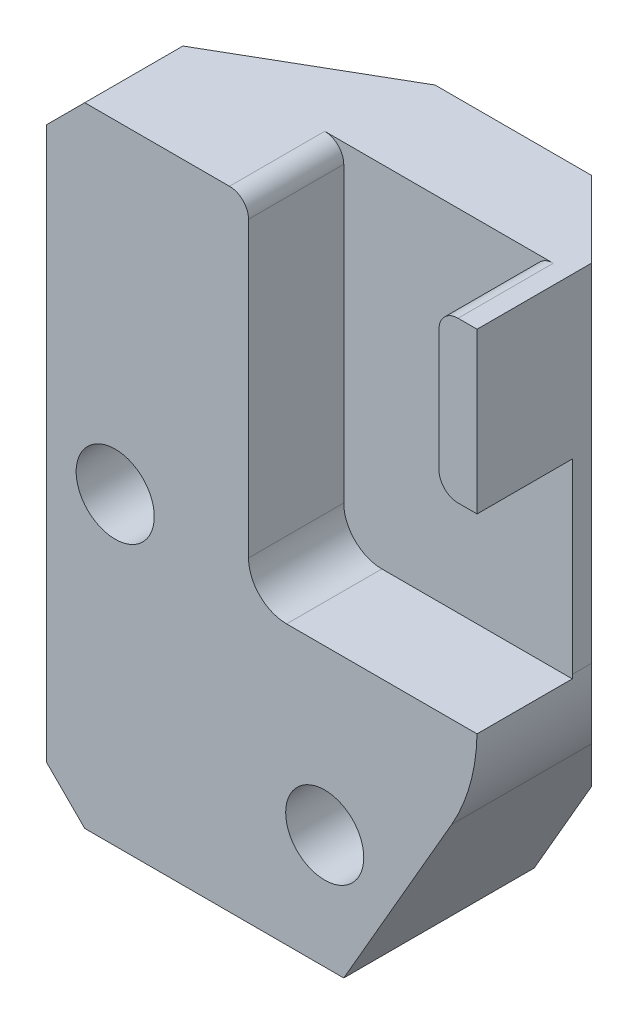
ISO-10303-21;
HEADER;
FILE_DESCRIPTION(('STEP AP214'),'2;1');
FILE_NAME('part.step','',(''),(''),'','','');
FILE_SCHEMA(('AUTOMOTIVE_DESIGN { 1 0 10303 214 1 1 1 1 }'));
ENDSEC;
DATA;
#1=APPLICATION_CONTEXT('core data for automotive mechanical design processes');
#2=APPLICATION_PROTOCOL_DEFINITION('international standard','automotive_design',2000,#1);
#3=PRODUCT_CONTEXT('',#1,'mechanical');
#4=PRODUCT('Part','Part','',(#3));
#5=PRODUCT_RELATED_PRODUCT_CATEGORY('part','',(#4));
#6=PRODUCT_DEFINITION_FORMATION('','',#4);
#7=PRODUCT_DEFINITION_CONTEXT('part definition',#1,'design');
#8=PRODUCT_DEFINITION('design','',#6,#7);
#9=PRODUCT_DEFINITION_SHAPE('','',#8);
#10=(LENGTH_UNIT() NAMED_UNIT(*) SI_UNIT(.MILLI.,.METRE.));
#11=(NAMED_UNIT(*) PLANE_ANGLE_UNIT() SI_UNIT($,.RADIAN.));
#12=(NAMED_UNIT(*) SI_UNIT($,.STERADIAN.) SOLID_ANGLE_UNIT());
#13=UNCERTAINTY_MEASURE_WITH_UNIT(LENGTH_MEASURE(1.E-05),#10,'distance_accuracy_value','');
#14=(GEOMETRIC_REPRESENTATION_CONTEXT(3) GLOBAL_UNCERTAINTY_ASSIGNED_CONTEXT((#13)) GLOBAL_UNIT_ASSIGNED_CONTEXT((#10,
#11,#12)) REPRESENTATION_CONTEXT('',''));
#15=CARTESIAN_POINT('',(0.,0.,0.));
#16=DIRECTION('',(0.,0.,1.));
#17=DIRECTION('',(1.,0.,0.));
#18=AXIS2_PLACEMENT_3D('',#15,#16,#17);
#19=CARTESIAN_POINT('',(-2.49999999999985,-10.,5.));
#20=DIRECTION('',(0.,0.,1.));
#21=DIRECTION('',(1.,0.,0.));
#22=AXIS2_PLACEMENT_3D('',#19,#20,#21);
#23=PLANE('',#22);
#24=CARTESIAN_POINT('',(-1.49999999999985,-7.00000000000001,5.));
#25=DIRECTION('',(0.,0.,1.));
#26=DIRECTION('',(1.,0.,0.));
#27=AXIS2_PLACEMENT_3D('',#24,#25,#26);
#28=CIRCLE('',#27,1.02499999999999);
#29=CARTESIAN_POINT('',(-0.47499999999986,-7.00000000000001,5.));
#30=VERTEX_POINT('',#29);
#31=EDGE_CURVE('E237',#30,#30,#28,.T.);
#32=ORIENTED_EDGE('',*,*,#31,.F.);
#33=EDGE_LOOP('',(#32));
#34=FACE_BOUND('',#33,.T.);
#35=CARTESIAN_POINT('',(-6.99999999999994,-1.99999999999999,5.));
#36=DIRECTION('',(0.,0.,1.));
#37=DIRECTION('',(1.,0.,0.));
#38=AXIS2_PLACEMENT_3D('',#35,#36,#37);
#39=CIRCLE('',#38,1.02499999999999);
#40=CARTESIAN_POINT('',(-5.97499999999995,-1.99999999999999,5.));
#41=VERTEX_POINT('',#40);
#42=EDGE_CURVE('E240',#41,#41,#39,.T.);
#43=ORIENTED_EDGE('',*,*,#42,.F.);
#44=EDGE_LOOP('',(#43));
#45=FACE_BOUND('',#44,.T.);
#46=DIRECTION('',(-0.500000000000001,-0.866025403784437,0.));
#47=VECTOR('',#46,1.);
#48=CARTESIAN_POINT('',(-1.37499999999995,-10.6495190528383,5.));
#49=LINE('',#48,#47);
#50=CARTESIAN_POINT('',(-0.999999999999987,-10.,5.));
#51=VERTEX_POINT('',#50);
#52=CARTESIAN_POINT('',(1.83012701892218,-5.09807621135332,5.));
#53=VERTEX_POINT('',#52);
#54=EDGE_CURVE('E293',#51,#53,#49,.F.);
#55=ORIENTED_EDGE('',*,*,#54,.T.);
#56=CARTESIAN_POINT('',(-2.49999999999993,-2.59807621135331,5.));
#57=DIRECTION('',(0.,0.,1.));
#58=DIRECTION('',(1.,0.,0.));
#59=AXIS2_PLACEMENT_3D('',#56,#57,#58);
#60=CIRCLE('',#59,5.);
#61=CARTESIAN_POINT('',(2.49896104618835,-2.7,5.));
#62=VERTEX_POINT('',#61);
#63=EDGE_CURVE('E60',#53,#62,#60,.T.);
#64=ORIENTED_EDGE('',*,*,#63,.T.);
#65=DIRECTION('',(-1.,0.,0.));
#66=VECTOR('',#65,1.);
#67=CARTESIAN_POINT('',(-2.5,-2.7,5.));
#68=LINE('',#67,#66);
#69=CARTESIAN_POINT('',(-2.5,-2.7,5.));
#70=VERTEX_POINT('',#69);
#71=EDGE_CURVE('E201',#62,#70,#68,.T.);
#72=ORIENTED_EDGE('',*,*,#71,.T.);
#73=CARTESIAN_POINT('',(-2.49999999999993,-1.70000000000001,5.));
#74=DIRECTION('',(0.,0.,-1.));
#75=DIRECTION('',(1.,0.,0.));
#76=AXIS2_PLACEMENT_3D('',#73,#74,#75);
#77=CIRCLE('',#76,1.);
#78=CARTESIAN_POINT('',(-3.49999999999993,-1.7,5.));
#79=VERTEX_POINT('',#78);
#80=EDGE_CURVE('E204',#70,#79,#77,.T.);
#81=ORIENTED_EDGE('',*,*,#80,.T.);
#82=DIRECTION('',(0.,1.,0.));
#83=VECTOR('',#82,1.);
#84=CARTESIAN_POINT('',(-3.5,5.5,5.));
#85=LINE('',#84,#83);
#86=CARTESIAN_POINT('',(-3.49999999999993,5.99999999999999,5.));
#87=VERTEX_POINT('',#86);
#88=EDGE_CURVE('E226',#79,#87,#85,.T.);
#89=ORIENTED_EDGE('',*,*,#88,.T.);
#90=CARTESIAN_POINT('',(-3.99999999999985,6.,5.));
#91=DIRECTION('',(0.,0.,1.));
#92=DIRECTION('',(1.,0.,0.));
#93=AXIS2_PLACEMENT_3D('',#90,#91,#92);
#94=CIRCLE('',#93,0.5);
#95=CARTESIAN_POINT('',(-4.,6.5,5.));
#96=VERTEX_POINT('',#95);
#97=EDGE_CURVE('E278',#87,#96,#94,.T.);
#98=ORIENTED_EDGE('',*,*,#97,.T.);
#99=DIRECTION('',(1.,0.,0.));
#100=VECTOR('',#99,1.);
#101=CARTESIAN_POINT('',(-9.29999999999993,6.5,5.));
#102=LINE('',#101,#100);
#103=CARTESIAN_POINT('',(-7.79999999999993,6.5,5.));
#104=VERTEX_POINT('',#103);
#105=EDGE_CURVE('E207',#104,#96,#102,.T.);
#106=ORIENTED_EDGE('',*,*,#105,.F.);
#107=DIRECTION('',(-0.70710678118655,-0.707106781186546,0.));
#108=VECTOR('',#107,1.);
#109=CARTESIAN_POINT('',(-13.4,0.900000000000034,5.));
#110=LINE('',#109,#108);
#111=CARTESIAN_POINT('',(-8.79999999999985,5.49999999999999,5.));
#112=VERTEX_POINT('',#111);
#113=EDGE_CURVE('E301',#104,#112,#110,.T.);
#114=ORIENTED_EDGE('',*,*,#113,.T.);
#115=DIRECTION('',(0.,1.,0.));
#116=VECTOR('',#115,1.);
#117=CARTESIAN_POINT('',(-8.79999999999985,-10.,5.));
#118=LINE('',#117,#116);
#119=CARTESIAN_POINT('',(-8.79999999999992,-8.99999999999999,5.));
#120=VERTEX_POINT('',#119);
#121=EDGE_CURVE('E350',#120,#112,#118,.T.);
#122=ORIENTED_EDGE('',*,*,#121,.F.);
#123=DIRECTION('',(0.707106781186548,-0.707106781186547,0.));
#124=VECTOR('',#123,1.);
#125=CARTESIAN_POINT('',(-5.15,-12.65,5.));
#126=LINE('',#125,#124);
#127=CARTESIAN_POINT('',(-7.79999999999993,-10.,5.));
#128=VERTEX_POINT('',#127);
#129=EDGE_CURVE('E303',#120,#128,#126,.T.);
#130=ORIENTED_EDGE('',*,*,#129,.T.);
#131=DIRECTION('',(1.,0.,0.));
#132=VECTOR('',#131,1.);
#133=CARTESIAN_POINT('',(-2.49999999999985,-10.,5.));
#134=LINE('',#133,#132);
#135=EDGE_CURVE('E243',#128,#51,#134,.T.);
#136=ORIENTED_EDGE('',*,*,#135,.T.);
#137=EDGE_LOOP('',(#55,#64,#72,#81,#89,#98,#106,#114,#122,#130,#136));
#138=FACE_BOUND('',#137,.T.);
#139=ADVANCED_FACE('F38',(#34,#45,#138),#23,.T.);
#140=CARTESIAN_POINT('',(-9.29999999999992,6.5,-12.3081273961557));
#141=DIRECTION('',(0.,-1.,0.));
#142=DIRECTION('',(0.,0.,-1.));
#143=AXIS2_PLACEMENT_3D('',#140,#141,#142);
#144=PLANE('',#143);
#145=DIRECTION('',(0.866025403784436,0.,-0.500000000000004));
#146=VECTOR('',#145,1.);
#147=CARTESIAN_POINT('',(-3.60384757729336,6.5,0.));
#148=LINE('',#147,#146);
#149=CARTESIAN_POINT('',(-7.8,6.5,2.42264973081036));
#150=VERTEX_POINT('',#149);
#151=CARTESIAN_POINT('',(-3.60384757729336,6.5,0.));
#152=VERTEX_POINT('',#151);
#153=EDGE_CURVE('E173',#150,#152,#148,.T.);
#154=ORIENTED_EDGE('',*,*,#153,.F.);
#155=DIRECTION('',(0.,0.,1.));
#156=VECTOR('',#155,1.);
#157=CARTESIAN_POINT('',(-7.79999999999993,6.5,5.));
#158=LINE('',#157,#156);
#159=EDGE_CURVE('E310',#150,#104,#158,.T.);
#160=ORIENTED_EDGE('',*,*,#159,.T.);
#161=ORIENTED_EDGE('',*,*,#105,.T.);
#162=DIRECTION('',(0.,0.,1.));
#163=VECTOR('',#162,1.);
#164=CARTESIAN_POINT('',(-4.,6.5,2.5));
#165=LINE('',#164,#163);
#166=CARTESIAN_POINT('',(-4.,6.5,2.5));
#167=VERTEX_POINT('',#166);
#168=EDGE_CURVE('E268',#96,#167,#165,.F.);
#169=ORIENTED_EDGE('',*,*,#168,.T.);
#170=DIRECTION('',(1.,0.,0.));
#171=VECTOR('',#170,1.);
#172=CARTESIAN_POINT('',(0.50000000000007,6.49999999999999,2.5));
#173=LINE('',#172,#171);
#174=CARTESIAN_POINT('',(2.00000000000007,6.5,2.5));
#175=VERTEX_POINT('',#174);
#176=EDGE_CURVE('E219',#167,#175,#173,.T.);
#177=ORIENTED_EDGE('',*,*,#176,.T.);
#178=DIRECTION('',(0.,0.,-1.));
#179=VECTOR('',#178,1.);
#180=CARTESIAN_POINT('',(2.00000000000007,6.5,5.));
#181=LINE('',#180,#179);
#182=CARTESIAN_POINT('',(2.00000000000007,6.5,5.));
#183=VERTEX_POINT('',#182);
#184=EDGE_CURVE('E271',#175,#183,#181,.F.);
#185=ORIENTED_EDGE('',*,*,#184,.T.);
#186=CARTESIAN_POINT('',(2.50000000000007,6.5,5.));
#187=VERTEX_POINT('',#186);
#188=EDGE_CURVE('E345',#183,#187,#102,.T.);
#189=ORIENTED_EDGE('',*,*,#188,.T.);
#190=DIRECTION('',(0.,0.,1.));
#191=VECTOR('',#190,1.);
#192=CARTESIAN_POINT('',(2.50000000000007,6.5,-12.3081273961558));
#193=LINE('',#192,#191);
#194=CARTESIAN_POINT('',(2.50000000000007,6.5,1.99999999999999));
#195=VERTEX_POINT('',#194);
#196=EDGE_CURVE('E202',#195,#187,#193,.T.);
#197=ORIENTED_EDGE('',*,*,#196,.F.);
#198=DIRECTION('',(0.707106781186549,0.,0.707106781186546));
#199=VECTOR('',#198,1.);
#200=CARTESIAN_POINT('',(2.50000000000007,6.5,1.99999999999999));
#201=LINE('',#200,#199);
#202=CARTESIAN_POINT('',(0.499999999999987,6.5,0.));
#203=VERTEX_POINT('',#202);
#204=EDGE_CURVE('E200',#195,#203,#201,.F.);
#205=ORIENTED_EDGE('',*,*,#204,.T.);
#206=DIRECTION('',(-1.,0.,0.));
#207=VECTOR('',#206,1.);
#208=CARTESIAN_POINT('',(-9.29999999999993,6.5,0.));
#209=LINE('',#208,#207);
#210=EDGE_CURVE('E191',#203,#152,#209,.T.);
#211=ORIENTED_EDGE('',*,*,#210,.T.);
#212=EDGE_LOOP('',(#154,#160,#161,#169,#177,#185,#189,#197,#205,#211));
#213=FACE_BOUND('',#212,.T.);
#214=ADVANCED_FACE('F197',(#213),#144,.F.);
#215=CARTESIAN_POINT('',(-2.49999999999985,-10.,5.));
#216=DIRECTION('',(0.,1.,0.));
#217=DIRECTION('',(0.,0.,1.));
#218=AXIS2_PLACEMENT_3D('',#215,#216,#217);
#219=PLANE('',#218);
#220=ORIENTED_EDGE('',*,*,#135,.F.);
#221=DIRECTION('',(0.,0.,-1.));
#222=VECTOR('',#221,1.);
#223=CARTESIAN_POINT('',(-7.79999999999993,-10.,3.));
#224=LINE('',#223,#222);
#225=CARTESIAN_POINT('',(-7.79999999999993,-10.,2.42264973081036));
#226=VERTEX_POINT('',#225);
#227=EDGE_CURVE('E305',#128,#226,#224,.T.);
#228=ORIENTED_EDGE('',*,*,#227,.T.);
#229=DIRECTION('',(-0.866025403784436,0.,0.500000000000004));
#230=VECTOR('',#229,1.);
#231=CARTESIAN_POINT('',(-3.60384757729343,-10.,0.));
#232=LINE('',#231,#230);
#233=CARTESIAN_POINT('',(-3.60384757729343,-10.,0.));
#234=VERTEX_POINT('',#233);
#235=EDGE_CURVE('E366',#234,#226,#232,.T.);
#236=ORIENTED_EDGE('',*,*,#235,.F.);
#237=DIRECTION('',(1.,0.,0.));
#238=VECTOR('',#237,1.);
#239=CARTESIAN_POINT('',(-2.49999999999993,-10.,0.));
#240=LINE('',#239,#238);
#241=CARTESIAN_POINT('',(-0.999999999999987,-10.,0.));
#242=VERTEX_POINT('',#241);
#243=EDGE_CURVE('E194',#234,#242,#240,.T.);
#244=ORIENTED_EDGE('',*,*,#243,.T.);
#245=DIRECTION('',(0.,0.,1.));
#246=VECTOR('',#245,1.);
#247=CARTESIAN_POINT('',(-0.999999999999987,-10.,5.));
#248=LINE('',#247,#246);
#249=EDGE_CURVE('E290',#242,#51,#248,.T.);
#250=ORIENTED_EDGE('',*,*,#249,.T.);
#251=EDGE_LOOP('',(#220,#228,#236,#244,#250));
#252=FACE_BOUND('',#251,.T.);
#253=ADVANCED_FACE('F364',(#252),#219,.F.);
#254=CARTESIAN_POINT('',(-2.49999999999993,-10.,0.));
#255=DIRECTION('',(0.,0.,1.));
#256=DIRECTION('',(1.,0.,0.));
#257=AXIS2_PLACEMENT_3D('',#254,#255,#256);
#258=PLANE('',#257);
#259=CARTESIAN_POINT('',(-1.49999999999985,-7.,0.));
#260=DIRECTION('',(0.,0.,-1.));
#261=DIRECTION('',(-1.,0.,0.));
#262=AXIS2_PLACEMENT_3D('',#259,#260,#261);
#263=CIRCLE('',#262,1.02499999999999);
#264=CARTESIAN_POINT('',(-2.52499999999984,-7.,0.));
#265=VERTEX_POINT('',#264);
#266=EDGE_CURVE('E234',#265,#265,#263,.T.);
#267=ORIENTED_EDGE('',*,*,#266,.F.);
#268=EDGE_LOOP('',(#267));
#269=FACE_BOUND('',#268,.T.);
#270=ORIENTED_EDGE('',*,*,#243,.F.);
#271=DIRECTION('',(0.,1.,0.));
#272=VECTOR('',#271,1.);
#273=CARTESIAN_POINT('',(-3.60384757729343,-16.,0.));
#274=LINE('',#273,#272);
#275=EDGE_CURVE('E178',#234,#152,#274,.T.);
#276=ORIENTED_EDGE('',*,*,#275,.T.);
#277=ORIENTED_EDGE('',*,*,#210,.F.);
#278=DIRECTION('',(0.,-1.,0.));
#279=VECTOR('',#278,1.);
#280=CARTESIAN_POINT('',(0.500000000000056,-10.,0.));
#281=LINE('',#280,#279);
#282=CARTESIAN_POINT('',(0.50000000000007,-7.40192378864668,0.));
#283=VERTEX_POINT('',#282);
#284=EDGE_CURVE('E252',#203,#283,#281,.T.);
#285=ORIENTED_EDGE('',*,*,#284,.T.);
#286=DIRECTION('',(0.500000000000001,0.866025403784437,0.));
#287=VECTOR('',#286,1.);
#288=CARTESIAN_POINT('',(2.50000000000006,-3.93782217350893,0.));
#289=LINE('',#288,#287);
#290=EDGE_CURVE('E288',#283,#242,#289,.F.);
#291=ORIENTED_EDGE('',*,*,#290,.T.);
#292=EDGE_LOOP('',(#270,#276,#277,#285,#291));
#293=FACE_BOUND('',#292,.T.);
#294=ADVANCED_FACE('F189',(#269,#293),#258,.F.);
#295=ORIENTED_EDGE('',*,*,#188,.F.);
#296=CARTESIAN_POINT('',(2.0000000000001,6.00000000000001,5.));
#297=DIRECTION('',(0.,0.,1.));
#298=DIRECTION('',(1.,0.,0.));
#299=AXIS2_PLACEMENT_3D('',#296,#297,#298);
#300=CIRCLE('',#299,0.5);
#301=CARTESIAN_POINT('',(1.50000000000007,6.,5.));
#302=VERTEX_POINT('',#301);
#303=EDGE_CURVE('E273',#183,#302,#300,.T.);
#304=ORIENTED_EDGE('',*,*,#303,.T.);
#305=DIRECTION('',(0.,-1.,0.));
#306=VECTOR('',#305,1.);
#307=CARTESIAN_POINT('',(1.50000000000007,-1.7,5.));
#308=LINE('',#307,#306);
#309=CARTESIAN_POINT('',(1.50000000000007,2.80000000000001,5.));
#310=VERTEX_POINT('',#309);
#311=EDGE_CURVE('E214',#302,#310,#308,.T.);
#312=ORIENTED_EDGE('',*,*,#311,.T.);
#313=CARTESIAN_POINT('',(2.00000000000015,2.79999999999999,5.));
#314=DIRECTION('',(0.,0.,1.));
#315=DIRECTION('',(1.,0.,0.));
#316=AXIS2_PLACEMENT_3D('',#313,#314,#315);
#317=CIRCLE('',#316,0.5);
#318=CARTESIAN_POINT('',(2.00000000000007,2.3,5.));
#319=VERTEX_POINT('',#318);
#320=EDGE_CURVE('E260',#310,#319,#317,.T.);
#321=ORIENTED_EDGE('',*,*,#320,.T.);
#322=DIRECTION('',(-1.,0.,0.));
#323=VECTOR('',#322,1.);
#324=CARTESIAN_POINT('',(0.50000000000007,2.29999999999999,5.));
#325=LINE('',#324,#323);
#326=CARTESIAN_POINT('',(2.50000000000014,2.3,5.));
#327=VERTEX_POINT('',#326);
#328=EDGE_CURVE('E347',#327,#319,#325,.T.);
#329=ORIENTED_EDGE('',*,*,#328,.F.);
#330=DIRECTION('',(0.,1.,0.));
#331=VECTOR('',#330,1.);
#332=CARTESIAN_POINT('',(2.50000000000007,10.,5.));
#333=LINE('',#332,#331);
#334=EDGE_CURVE('E245',#327,#187,#333,.T.);
#335=ORIENTED_EDGE('',*,*,#334,.T.);
#336=EDGE_LOOP('',(#295,#304,#312,#321,#329,#335));
#337=FACE_BOUND('',#336,.T.);
#338=ADVANCED_FACE('F360',(#337),#23,.T.);
#339=CARTESIAN_POINT('',(2.50000000000007,10.,5.));
#340=DIRECTION('',(-1.,0.,0.));
#341=DIRECTION('',(0.,0.,1.));
#342=AXIS2_PLACEMENT_3D('',#339,#340,#341);
#343=PLANE('',#342);
#344=DIRECTION('',(0.,-1.,0.));
#345=VECTOR('',#344,1.);
#346=CARTESIAN_POINT('',(2.50000000000007,-2.7,2.5));
#347=LINE('',#346,#345);
#348=CARTESIAN_POINT('',(2.50000000000007,2.3,2.5));
#349=VERTEX_POINT('',#348);
#350=CARTESIAN_POINT('',(2.50000000000007,-2.59807621135332,2.5));
#351=VERTEX_POINT('',#350);
#352=EDGE_CURVE('E335',#349,#351,#347,.T.);
#353=ORIENTED_EDGE('',*,*,#352,.T.);
#354=DIRECTION('',(0.,0.,1.));
#355=VECTOR('',#354,1.);
#356=CARTESIAN_POINT('',(2.50000000000007,-2.59807621135332,1.99999999999999));
#357=LINE('',#356,#355);
#358=CARTESIAN_POINT('',(2.50000000000007,-2.59807621135332,1.99999999999999));
#359=VERTEX_POINT('',#358);
#360=EDGE_CURVE('E312',#351,#359,#357,.F.);
#361=ORIENTED_EDGE('',*,*,#360,.T.);
#362=DIRECTION('',(0.,1.,0.));
#363=VECTOR('',#362,1.);
#364=CARTESIAN_POINT('',(2.50000000000007,10.,1.99999999999999));
#365=LINE('',#364,#363);
#366=EDGE_CURVE('E248',#359,#195,#365,.T.);
#367=ORIENTED_EDGE('',*,*,#366,.T.);
#368=ORIENTED_EDGE('',*,*,#196,.T.);
#369=ORIENTED_EDGE('',*,*,#334,.F.);
#370=DIRECTION('',(0.,0.,1.));
#371=VECTOR('',#370,1.);
#372=CARTESIAN_POINT('',(2.50000000000007,2.3,-2.88516480713451));
#373=LINE('',#372,#371);
#374=EDGE_CURVE('E342',#349,#327,#373,.T.);
#375=ORIENTED_EDGE('',*,*,#374,.F.);
#376=EDGE_LOOP('',(#353,#361,#367,#368,#369,#375));
#377=FACE_BOUND('',#376,.T.);
#378=ADVANCED_FACE('F339',(#377),#343,.F.);
#379=CARTESIAN_POINT('',(-6.99999999999994,-1.99999999999999,0.));
#380=DIRECTION('',(0.,0.,-1.));
#381=DIRECTION('',(-1.,0.,0.));
#382=AXIS2_PLACEMENT_3D('',#379,#380,#381);
#383=CYLINDRICAL_SURFACE('',#382,1.02499999999999);
#384=CARTESIAN_POINT('',(-6.99999999999994,-1.99999999999999,1.96076951545866));
#385=DIRECTION('',(0.500000000000004,0.,0.866025403784436));
#386=DIRECTION('',(0.866025403784436,0.,-0.500000000000004));
#387=AXIS2_PLACEMENT_3D('',#384,#385,#386);
#388=ELLIPSE('',#387,1.18356805183872,1.02499999999999);
#389=CARTESIAN_POINT('',(-5.97499999999995,-1.99999999999999,1.36898548953929));
#390=VERTEX_POINT('',#389);
#391=EDGE_CURVE('E368',#390,#390,#388,.F.);
#392=ORIENTED_EDGE('',*,*,#391,.T.);
#393=EDGE_LOOP('',(#392));
#394=FACE_BOUND('',#393,.T.);
#395=ORIENTED_EDGE('',*,*,#42,.T.);
#396=EDGE_LOOP('',(#395));
#397=FACE_BOUND('',#396,.T.);
#398=ADVANCED_FACE('F429',(#394,#397),#383,.F.);
#399=CARTESIAN_POINT('',(-1.49999999999985,-7.,0.));
#400=DIRECTION('',(0.,0.,-1.));
#401=DIRECTION('',(-1.,0.,0.));
#402=AXIS2_PLACEMENT_3D('',#399,#400,#401);
#403=CYLINDRICAL_SURFACE('',#402,1.02499999999999);
#404=ORIENTED_EDGE('',*,*,#31,.T.);
#405=EDGE_LOOP('',(#404));
#406=FACE_BOUND('',#405,.T.);
#407=ORIENTED_EDGE('',*,*,#266,.T.);
#408=EDGE_LOOP('',(#407));
#409=FACE_BOUND('',#408,.T.);
#410=ADVANCED_FACE('F564',(#406,#409),#403,.F.);
#411=CARTESIAN_POINT('',(-2.50000000000002,-2.70000000000001,2.5));
#412=DIRECTION('',(0.,1.,0.));
#413=DIRECTION('',(0.,0.,1.));
#414=AXIS2_PLACEMENT_3D('',#411,#412,#413);
#415=PLANE('',#414);
#416=ORIENTED_EDGE('',*,*,#71,.F.);
#417=DIRECTION('',(0.,0.,-1.));
#418=VECTOR('',#417,1.);
#419=CARTESIAN_POINT('',(2.49896104618835,-2.7,5.));
#420=LINE('',#419,#418);
#421=CARTESIAN_POINT('',(2.49896104618835,-2.70000000000001,2.5));
#422=VERTEX_POINT('',#421);
#423=EDGE_CURVE('E46',#62,#422,#420,.T.);
#424=ORIENTED_EDGE('',*,*,#423,.T.);
#425=DIRECTION('',(-1.,0.,0.));
#426=VECTOR('',#425,1.);
#427=CARTESIAN_POINT('',(-2.50000000000002,-2.70000000000001,2.5));
#428=LINE('',#427,#426);
#429=CARTESIAN_POINT('',(-2.50000000000002,-2.70000000000001,2.5));
#430=VERTEX_POINT('',#429);
#431=EDGE_CURVE('E211',#422,#430,#428,.T.);
#432=ORIENTED_EDGE('',*,*,#431,.T.);
#433=DIRECTION('',(0.,0.,1.));
#434=VECTOR('',#433,1.);
#435=CARTESIAN_POINT('',(-2.50000000000002,-2.70000000000001,2.5));
#436=LINE('',#435,#434);
#437=EDGE_CURVE('E231',#430,#70,#436,.T.);
#438=ORIENTED_EDGE('',*,*,#437,.T.);
#439=EDGE_LOOP('',(#416,#424,#432,#438));
#440=FACE_BOUND('',#439,.T.);
#441=ADVANCED_FACE('F554',(#440),#415,.T.);
#442=CARTESIAN_POINT('',(-2.49999999999993,-1.70000000000002,2.5));
#443=DIRECTION('',(0.,0.,1.));
#444=DIRECTION('',(1.,0.,0.));
#445=AXIS2_PLACEMENT_3D('',#442,#443,#444);
#446=CYLINDRICAL_SURFACE('',#445,1.);
#447=ORIENTED_EDGE('',*,*,#80,.F.);
#448=ORIENTED_EDGE('',*,*,#437,.F.);
#449=CARTESIAN_POINT('',(-2.49999999999993,-1.70000000000002,2.5));
#450=DIRECTION('',(0.,0.,-1.));
#451=DIRECTION('',(1.,0.,0.));
#452=AXIS2_PLACEMENT_3D('',#449,#450,#451);
#453=CIRCLE('',#452,1.);
#454=CARTESIAN_POINT('',(-3.49999999999993,-1.7,2.5));
#455=VERTEX_POINT('',#454);
#456=EDGE_CURVE('E213',#430,#455,#453,.T.);
#457=ORIENTED_EDGE('',*,*,#456,.T.);
#458=DIRECTION('',(0.,0.,1.));
#459=VECTOR('',#458,1.);
#460=CARTESIAN_POINT('',(-3.49999999999993,-1.7,2.5));
#461=LINE('',#460,#459);
#462=EDGE_CURVE('E222',#455,#79,#461,.T.);
#463=ORIENTED_EDGE('',*,*,#462,.T.);
#464=EDGE_LOOP('',(#447,#448,#457,#463));
#465=FACE_BOUND('',#464,.T.);
#466=ADVANCED_FACE('F542',(#465),#446,.F.);
#467=CARTESIAN_POINT('',(-3.5,5.5,2.5));
#468=DIRECTION('',(1.,0.,0.));
#469=DIRECTION('',(0.,0.,-1.));
#470=AXIS2_PLACEMENT_3D('',#467,#468,#469);
#471=PLANE('',#470);
#472=DIRECTION('',(0.,1.,0.));
#473=VECTOR('',#472,1.);
#474=CARTESIAN_POINT('',(-3.5,5.5,2.5));
#475=LINE('',#474,#473);
#476=CARTESIAN_POINT('',(-3.49999999999993,5.99999999999999,2.5));
#477=VERTEX_POINT('',#476);
#478=EDGE_CURVE('E216',#455,#477,#475,.T.);
#479=ORIENTED_EDGE('',*,*,#478,.T.);
#480=DIRECTION('',(0.,0.,1.));
#481=VECTOR('',#480,1.);
#482=CARTESIAN_POINT('',(-3.49999999999993,5.99999999999999,5.));
#483=LINE('',#482,#481);
#484=EDGE_CURVE('E275',#477,#87,#483,.T.);
#485=ORIENTED_EDGE('',*,*,#484,.T.);
#486=ORIENTED_EDGE('',*,*,#88,.F.);
#487=ORIENTED_EDGE('',*,*,#462,.F.);
#488=EDGE_LOOP('',(#479,#485,#486,#487));
#489=FACE_BOUND('',#488,.T.);
#490=ADVANCED_FACE('F532',(#489),#471,.T.);
#491=CARTESIAN_POINT('',(1.50000000000006,-1.7,2.5));
#492=DIRECTION('',(-1.,0.,0.));
#493=DIRECTION('',(0.,0.,1.));
#494=AXIS2_PLACEMENT_3D('',#491,#492,#493);
#495=PLANE('',#494);
#496=ORIENTED_EDGE('',*,*,#311,.F.);
#497=DIRECTION('',(0.,0.,-1.));
#498=VECTOR('',#497,1.);
#499=CARTESIAN_POINT('',(1.50000000000007,6.,2.5));
#500=LINE('',#499,#498);
#501=CARTESIAN_POINT('',(1.50000000000007,6.,2.5));
#502=VERTEX_POINT('',#501);
#503=EDGE_CURVE('E265',#302,#502,#500,.T.);
#504=ORIENTED_EDGE('',*,*,#503,.T.);
#505=DIRECTION('',(0.,-1.,0.));
#506=VECTOR('',#505,1.);
#507=CARTESIAN_POINT('',(1.50000000000006,-1.7,2.5));
#508=LINE('',#507,#506);
#509=CARTESIAN_POINT('',(1.50000000000007,2.80000000000001,2.5));
#510=VERTEX_POINT('',#509);
#511=EDGE_CURVE('E221',#502,#510,#508,.T.);
#512=ORIENTED_EDGE('',*,*,#511,.T.);
#513=DIRECTION('',(0.,0.,-1.));
#514=VECTOR('',#513,1.);
#515=CARTESIAN_POINT('',(1.50000000000007,2.80000000000001,5.));
#516=LINE('',#515,#514);
#517=EDGE_CURVE('E257',#510,#310,#516,.F.);
#518=ORIENTED_EDGE('',*,*,#517,.T.);
#519=EDGE_LOOP('',(#496,#504,#512,#518));
#520=FACE_BOUND('',#519,.T.);
#521=ADVANCED_FACE('F396',(#520),#495,.T.);
#522=CARTESIAN_POINT('',(0.50000000000007,-1.7,2.5));
#523=DIRECTION('',(0.,0.,1.));
#524=DIRECTION('',(1.,0.,0.));
#525=AXIS2_PLACEMENT_3D('',#522,#523,#524);
#526=PLANE('',#525);
#527=ORIENTED_EDGE('',*,*,#431,.F.);
#528=CARTESIAN_POINT('',(-2.49999999999993,-2.59807621135332,2.5));
#529=DIRECTION('',(0.,0.,1.));
#530=DIRECTION('',(1.,0.,0.));
#531=AXIS2_PLACEMENT_3D('',#528,#529,#530);
#532=CIRCLE('',#531,5.);
#533=EDGE_CURVE('E12',#422,#351,#532,.T.);
#534=ORIENTED_EDGE('',*,*,#533,.T.);
#535=ORIENTED_EDGE('',*,*,#352,.F.);
#536=DIRECTION('',(1.,0.,0.));
#537=VECTOR('',#536,1.);
#538=CARTESIAN_POINT('',(0.50000000000007,2.29999999999999,2.5));
#539=LINE('',#538,#537);
#540=CARTESIAN_POINT('',(2.00000000000007,2.29999999999999,2.5));
#541=VERTEX_POINT('',#540);
#542=EDGE_CURVE('E343',#541,#349,#539,.T.);
#543=ORIENTED_EDGE('',*,*,#542,.F.);
#544=CARTESIAN_POINT('',(2.00000000000015,2.79999999999998,2.5));
#545=DIRECTION('',(0.,0.,1.));
#546=DIRECTION('',(1.,0.,0.));
#547=AXIS2_PLACEMENT_3D('',#544,#545,#546);
#548=CIRCLE('',#547,0.5);
#549=EDGE_CURVE('E262',#541,#510,#548,.F.);
#550=ORIENTED_EDGE('',*,*,#549,.T.);
#551=ORIENTED_EDGE('',*,*,#511,.F.);
#552=CARTESIAN_POINT('',(1.99999999999999,6.,2.5));
#553=DIRECTION('',(0.,0.,1.));
#554=DIRECTION('',(1.,0.,0.));
#555=AXIS2_PLACEMENT_3D('',#552,#553,#554);
#556=CIRCLE('',#555,0.5);
#557=EDGE_CURVE('E281',#502,#175,#556,.F.);
#558=ORIENTED_EDGE('',*,*,#557,.T.);
#559=ORIENTED_EDGE('',*,*,#176,.F.);
#560=CARTESIAN_POINT('',(-3.99999999999985,6.,2.5));
#561=DIRECTION('',(0.,0.,1.));
#562=DIRECTION('',(1.,0.,0.));
#563=AXIS2_PLACEMENT_3D('',#560,#561,#562);
#564=CIRCLE('',#563,0.5);
#565=EDGE_CURVE('E284',#167,#477,#564,.F.);
#566=ORIENTED_EDGE('',*,*,#565,.T.);
#567=ORIENTED_EDGE('',*,*,#478,.F.);
#568=ORIENTED_EDGE('',*,*,#456,.F.);
#569=EDGE_LOOP('',(#527,#534,#535,#543,#550,#551,#558,#559,#566,#567,#568));
#570=FACE_BOUND('',#569,.T.);
#571=ADVANCED_FACE('F333',(#570),#526,.T.);
#572=CARTESIAN_POINT('',(2.50000000000007,10.,1.99999999999999));
#573=DIRECTION('',(-0.707106781186546,0.,0.707106781186549));
#574=DIRECTION('',(0.707106781186549,0.,0.707106781186546));
#575=AXIS2_PLACEMENT_3D('',#572,#573,#574);
#576=PLANE('',#575);
#577=ORIENTED_EDGE('',*,*,#366,.F.);
#578=CARTESIAN_POINT('',(-2.5,-2.59807621135331,-2.99999999999999));
#579=DIRECTION('',(-0.707106781186546,0.,0.707106781186549));
#580=DIRECTION('',(-0.707106781186549,0.,-0.707106781186546));
#581=AXIS2_PLACEMENT_3D('',#578,#579,#580);
#582=ELLIPSE('',#581,7.07106781186546,5.);
#583=CARTESIAN_POINT('',(1.83012701892218,-5.09807621135332,1.33012701892219));
#584=VERTEX_POINT('',#583);
#585=EDGE_CURVE('E315',#359,#584,#582,.F.);
#586=ORIENTED_EDGE('',*,*,#585,.T.);
#587=DIRECTION('',(-0.447213595499959,-0.774596669241484,-0.447213595499957));
#588=VECTOR('',#587,1.);
#589=CARTESIAN_POINT('',(7.3282032302756,4.42487113059643,6.8282032302755));
#590=LINE('',#589,#588);
#591=EDGE_CURVE('E286',#584,#283,#590,.T.);
#592=ORIENTED_EDGE('',*,*,#591,.T.);
#593=ORIENTED_EDGE('',*,*,#284,.F.);
#594=ORIENTED_EDGE('',*,*,#204,.F.);
#595=EDGE_LOOP('',(#577,#586,#592,#593,#594));
#596=FACE_BOUND('',#595,.T.);
#597=ADVANCED_FACE('F362',(#596),#576,.F.);
#598=CARTESIAN_POINT('',(0.50000000000007,2.29999999999998,-2.88516480713451));
#599=DIRECTION('',(0.,1.,0.));
#600=DIRECTION('',(-1.,0.,0.));
#601=AXIS2_PLACEMENT_3D('',#598,#599,#600);
#602=PLANE('',#601);
#603=ORIENTED_EDGE('',*,*,#328,.T.);
#604=DIRECTION('',(0.,0.,-1.));
#605=VECTOR('',#604,1.);
#606=CARTESIAN_POINT('',(2.00000000000007,2.29999999999999,2.5));
#607=LINE('',#606,#605);
#608=EDGE_CURVE('E254',#319,#541,#607,.T.);
#609=ORIENTED_EDGE('',*,*,#608,.T.);
#610=ORIENTED_EDGE('',*,*,#542,.T.);
#611=ORIENTED_EDGE('',*,*,#374,.T.);
#612=EDGE_LOOP('',(#603,#609,#610,#611));
#613=FACE_BOUND('',#612,.T.);
#614=ADVANCED_FACE('F403',(#613),#602,.F.);
#615=CARTESIAN_POINT('',(2.00000000000014,2.79999999999998,-2.88516480713451));
#616=DIRECTION('',(0.,0.,1.));
#617=DIRECTION('',(1.,0.,0.));
#618=AXIS2_PLACEMENT_3D('',#615,#616,#617);
#619=CYLINDRICAL_SURFACE('',#618,0.5);
#620=ORIENTED_EDGE('',*,*,#320,.F.);
#621=ORIENTED_EDGE('',*,*,#517,.F.);
#622=ORIENTED_EDGE('',*,*,#549,.F.);
#623=ORIENTED_EDGE('',*,*,#608,.F.);
#624=EDGE_LOOP('',(#620,#621,#622,#623));
#625=FACE_BOUND('',#624,.T.);
#626=ADVANCED_FACE('F401',(#625),#619,.T.);
#627=CARTESIAN_POINT('',(1.99999999999999,6.,2.5));
#628=DIRECTION('',(0.,0.,1.));
#629=DIRECTION('',(1.,0.,0.));
#630=AXIS2_PLACEMENT_3D('',#627,#628,#629);
#631=CYLINDRICAL_SURFACE('',#630,0.5);
#632=ORIENTED_EDGE('',*,*,#303,.F.);
#633=ORIENTED_EDGE('',*,*,#184,.F.);
#634=ORIENTED_EDGE('',*,*,#557,.F.);
#635=ORIENTED_EDGE('',*,*,#503,.F.);
#636=EDGE_LOOP('',(#632,#633,#634,#635));
#637=FACE_BOUND('',#636,.T.);
#638=ADVANCED_FACE('F393',(#637),#631,.T.);
#639=CARTESIAN_POINT('',(-3.99999999999985,6.,2.5));
#640=DIRECTION('',(0.,0.,-1.));
#641=DIRECTION('',(-1.,0.,0.));
#642=AXIS2_PLACEMENT_3D('',#639,#640,#641);
#643=CYLINDRICAL_SURFACE('',#642,0.5);
#644=ORIENTED_EDGE('',*,*,#565,.F.);
#645=ORIENTED_EDGE('',*,*,#168,.F.);
#646=ORIENTED_EDGE('',*,*,#97,.F.);
#647=ORIENTED_EDGE('',*,*,#484,.F.);
#648=EDGE_LOOP('',(#644,#645,#646,#647));
#649=FACE_BOUND('',#648,.T.);
#650=ADVANCED_FACE('F389',(#649),#643,.T.);
#651=CARTESIAN_POINT('',(2.50000000000007,-3.93782217350894,5.));
#652=DIRECTION('',(-0.866025403784437,0.500000000000001,0.));
#653=DIRECTION('',(-0.500000000000001,-0.866025403784437,0.));
#654=AXIS2_PLACEMENT_3D('',#651,#652,#653);
#655=PLANE('',#654);
#656=ORIENTED_EDGE('',*,*,#591,.F.);
#657=DIRECTION('',(0.,0.,-1.));
#658=VECTOR('',#657,1.);
#659=CARTESIAN_POINT('',(1.83012701892218,-5.09807621135332,5.));
#660=LINE('',#659,#658);
#661=EDGE_CURVE('E317',#584,#53,#660,.F.);
#662=ORIENTED_EDGE('',*,*,#661,.T.);
#663=ORIENTED_EDGE('',*,*,#54,.F.);
#664=ORIENTED_EDGE('',*,*,#249,.F.);
#665=ORIENTED_EDGE('',*,*,#290,.F.);
#666=EDGE_LOOP('',(#656,#662,#663,#664,#665));
#667=FACE_BOUND('',#666,.T.);
#668=ADVANCED_FACE('F323',(#667),#655,.F.);
#669=CARTESIAN_POINT('',(-8.79999999999986,6.5,5.));
#670=DIRECTION('',(-1.,0.,0.));
#671=DIRECTION('',(0.,0.,1.));
#672=AXIS2_PLACEMENT_3D('',#669,#670,#671);
#673=PLANE('',#672);
#674=DIRECTION('',(0.,1.,0.));
#675=VECTOR('',#674,1.);
#676=CARTESIAN_POINT('',(-8.8,-16.,3.));
#677=LINE('',#676,#675);
#678=CARTESIAN_POINT('',(-8.79999999999992,-8.99999999999999,3.));
#679=VERTEX_POINT('',#678);
#680=CARTESIAN_POINT('',(-8.79999999999985,5.50000000000001,3.));
#681=VERTEX_POINT('',#680);
#682=EDGE_CURVE('E195',#679,#681,#677,.T.);
#683=ORIENTED_EDGE('',*,*,#682,.F.);
#684=DIRECTION('',(0.,0.,1.));
#685=VECTOR('',#684,1.);
#686=CARTESIAN_POINT('',(-8.79999999999992,-8.99999999999999,5.));
#687=LINE('',#686,#685);
#688=EDGE_CURVE('E298',#679,#120,#687,.T.);
#689=ORIENTED_EDGE('',*,*,#688,.T.);
#690=ORIENTED_EDGE('',*,*,#121,.T.);
#691=DIRECTION('',(0.,0.,-1.));
#692=VECTOR('',#691,1.);
#693=CARTESIAN_POINT('',(-8.79999999999985,5.5,3.));
#694=LINE('',#693,#692);
#695=EDGE_CURVE('E295',#112,#681,#694,.T.);
#696=ORIENTED_EDGE('',*,*,#695,.T.);
#697=EDGE_LOOP('',(#683,#689,#690,#696));
#698=FACE_BOUND('',#697,.T.);
#699=ADVANCED_FACE('F375',(#698),#673,.T.);
#700=CARTESIAN_POINT('',(-3.60384757729343,-16.,0.));
#701=DIRECTION('',(0.500000000000004,0.,0.866025403784436));
#702=DIRECTION('',(0.866025403784436,0.,-0.500000000000004));
#703=AXIS2_PLACEMENT_3D('',#700,#701,#702);
#704=PLANE('',#703);
#705=ORIENTED_EDGE('',*,*,#235,.T.);
#706=DIRECTION('',(-0.654653670707977,0.654653670707976,0.377964473009231));
#707=VECTOR('',#706,1.);
#708=CARTESIAN_POINT('',(-9.29487165930533,-8.5051283406946,3.28571428571429));
#709=LINE('',#708,#707);
#710=EDGE_CURVE('E308',#226,#679,#709,.T.);
#711=ORIENTED_EDGE('',*,*,#710,.T.);
#712=ORIENTED_EDGE('',*,*,#682,.T.);
#713=DIRECTION('',(0.654653670707978,0.654653670707974,-0.377964473009231));
#714=VECTOR('',#713,1.);
#715=CARTESIAN_POINT('',(-9.29487165930533,5.0051283406946,3.28571428571429));
#716=LINE('',#715,#714);
#717=EDGE_CURVE('E181',#681,#150,#716,.T.);
#718=ORIENTED_EDGE('',*,*,#717,.T.);
#719=ORIENTED_EDGE('',*,*,#153,.T.);
#720=ORIENTED_EDGE('',*,*,#275,.F.);
#721=EDGE_LOOP('',(#705,#711,#712,#718,#719,#720));
#722=FACE_BOUND('',#721,.T.);
#723=ORIENTED_EDGE('',*,*,#391,.F.);
#724=EDGE_LOOP('',(#723));
#725=FACE_BOUND('',#724,.T.);
#726=ADVANCED_FACE('F176',(#722,#725),#704,.F.);
#727=CARTESIAN_POINT('',(-8.79999999999992,-8.99999999999999,5.));
#728=DIRECTION('',(-0.707106781186547,-0.707106781186548,0.));
#729=DIRECTION('',(0.707106781186548,-0.707106781186547,0.));
#730=AXIS2_PLACEMENT_3D('',#727,#728,#729);
#731=PLANE('',#730);
#732=ORIENTED_EDGE('',*,*,#710,.F.);
#733=ORIENTED_EDGE('',*,*,#227,.F.);
#734=ORIENTED_EDGE('',*,*,#129,.F.);
#735=ORIENTED_EDGE('',*,*,#688,.F.);
#736=EDGE_LOOP('',(#732,#733,#734,#735));
#737=FACE_BOUND('',#736,.T.);
#738=ADVANCED_FACE('F380',(#737),#731,.T.);
#739=CARTESIAN_POINT('',(-8.79999999999985,5.5,5.));
#740=DIRECTION('',(-0.707106781186546,0.70710678118655,0.));
#741=DIRECTION('',(-0.70710678118655,-0.707106781186546,0.));
#742=AXIS2_PLACEMENT_3D('',#739,#740,#741);
#743=PLANE('',#742);
#744=ORIENTED_EDGE('',*,*,#113,.F.);
#745=ORIENTED_EDGE('',*,*,#159,.F.);
#746=ORIENTED_EDGE('',*,*,#717,.F.);
#747=ORIENTED_EDGE('',*,*,#695,.F.);
#748=EDGE_LOOP('',(#744,#745,#746,#747));
#749=FACE_BOUND('',#748,.T.);
#750=ADVANCED_FACE('F383',(#749),#743,.T.);
#751=CARTESIAN_POINT('',(-2.49999999999993,-2.59807621135331,5.));
#752=DIRECTION('',(0.,0.,-1.));
#753=DIRECTION('',(-1.,0.,0.));
#754=AXIS2_PLACEMENT_3D('',#751,#752,#753);
#755=CYLINDRICAL_SURFACE('',#754,5.);
#756=ORIENTED_EDGE('',*,*,#63,.F.);
#757=ORIENTED_EDGE('',*,*,#661,.F.);
#758=ORIENTED_EDGE('',*,*,#585,.F.);
#759=ORIENTED_EDGE('',*,*,#360,.F.);
#760=ORIENTED_EDGE('',*,*,#533,.F.);
#761=ORIENTED_EDGE('',*,*,#423,.F.);
#762=EDGE_LOOP('',(#756,#757,#758,#759,#760,#761));
#763=FACE_BOUND('',#762,.T.);
#764=ADVANCED_FACE('F40',(#763),#755,.T.);
#765=CLOSED_SHELL('',(#139,#214,#253,#294,#338,#378,#398,#410,#441,#466,#490,#521,#571,#597,
#614,#626,#638,#650,#668,#699,#726,#738,#750,#764));
#766=MANIFOLD_SOLID_BREP('B2',#765);
#767=ADVANCED_BREP_SHAPE_REPRESENTATION('',(#18,#766),#14);
#768=SHAPE_DEFINITION_REPRESENTATION(#9,#767);
ENDSEC;
END-ISO-10303-21;
